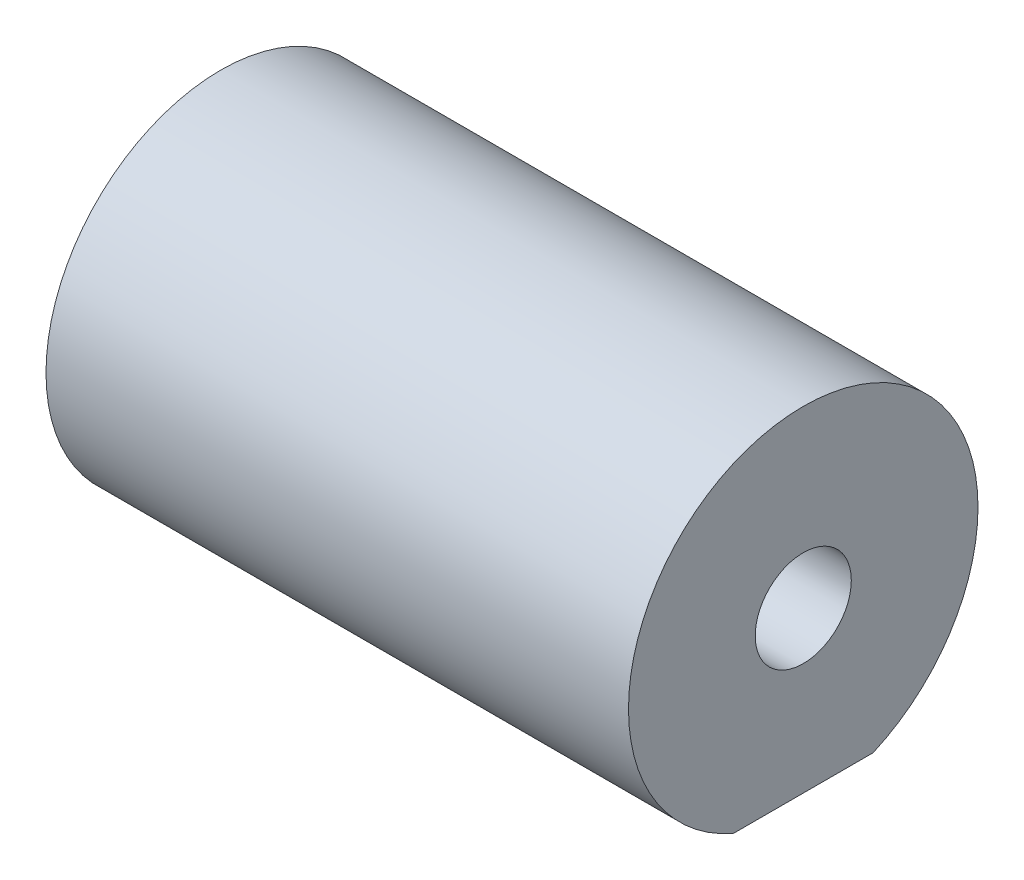
ISO-10303-21;
HEADER;
FILE_DESCRIPTION(('STEP AP214'),'2;1');
FILE_NAME('part.step','',(''),(''),'','','');
FILE_SCHEMA(('AUTOMOTIVE_DESIGN { 1 0 10303 214 1 1 1 1 }'));
ENDSEC;
DATA;
#1=APPLICATION_CONTEXT('core data for automotive mechanical design processes');
#2=APPLICATION_PROTOCOL_DEFINITION('international standard','automotive_design',2000,#1);
#3=PRODUCT_CONTEXT('',#1,'mechanical');
#4=PRODUCT('Part','Part','',(#3));
#5=PRODUCT_RELATED_PRODUCT_CATEGORY('part','',(#4));
#6=PRODUCT_DEFINITION_FORMATION('','',#4);
#7=PRODUCT_DEFINITION_CONTEXT('part definition',#1,'design');
#8=PRODUCT_DEFINITION('design','',#6,#7);
#9=PRODUCT_DEFINITION_SHAPE('','',#8);
#10=(LENGTH_UNIT() NAMED_UNIT(*) SI_UNIT(.MILLI.,.METRE.));
#11=(NAMED_UNIT(*) PLANE_ANGLE_UNIT() SI_UNIT($,.RADIAN.));
#12=(NAMED_UNIT(*) SI_UNIT($,.STERADIAN.) SOLID_ANGLE_UNIT());
#13=UNCERTAINTY_MEASURE_WITH_UNIT(LENGTH_MEASURE(1.E-05),#10,'distance_accuracy_value','');
#14=(GEOMETRIC_REPRESENTATION_CONTEXT(3) GLOBAL_UNCERTAINTY_ASSIGNED_CONTEXT((#13)) GLOBAL_UNIT_ASSIGNED_CONTEXT((#10,
#11,#12)) REPRESENTATION_CONTEXT('',''));
#15=CARTESIAN_POINT('',(0.,0.,0.));
#16=DIRECTION('',(0.,0.,1.));
#17=DIRECTION('',(1.,0.,0.));
#18=AXIS2_PLACEMENT_3D('',#15,#16,#17);
#19=CARTESIAN_POINT('',(20.,0.,0.));
#20=DIRECTION('',(-1.,0.,0.));
#21=DIRECTION('',(0.,0.,1.));
#22=AXIS2_PLACEMENT_3D('',#19,#20,#21);
#23=CYLINDRICAL_SURFACE('',#22,6.);
#24=CARTESIAN_POINT('',(20.,0.,0.));
#25=DIRECTION('',(1.,0.,0.));
#26=DIRECTION('',(0.,0.,-1.));
#27=AXIS2_PLACEMENT_3D('',#24,#25,#26);
#28=CIRCLE('',#27,6.);
#29=CARTESIAN_POINT('',(20.,-5.5,-2.39791576165636));
#30=VERTEX_POINT('',#29);
#31=CARTESIAN_POINT('',(20.,-5.5,2.39791576165636));
#32=VERTEX_POINT('',#31);
#33=EDGE_CURVE('E11',#30,#32,#28,.T.);
#34=ORIENTED_EDGE('',*,*,#33,.F.);
#35=DIRECTION('',(1.,0.,0.));
#36=VECTOR('',#35,1.);
#37=CARTESIAN_POINT('',(0.,-5.5,-2.39791576165636));
#38=LINE('',#37,#36);
#39=CARTESIAN_POINT('',(0.,-5.5,-2.39791576165636));
#40=VERTEX_POINT('',#39);
#41=EDGE_CURVE('E59',#40,#30,#38,.T.);
#42=ORIENTED_EDGE('',*,*,#41,.F.);
#43=CARTESIAN_POINT('',(0.,0.,0.));
#44=DIRECTION('',(1.,0.,0.));
#45=DIRECTION('',(0.,0.,-1.));
#46=AXIS2_PLACEMENT_3D('',#43,#44,#45);
#47=CIRCLE('',#46,6.);
#48=CARTESIAN_POINT('',(0.,-5.5,2.39791576165636));
#49=VERTEX_POINT('',#48);
#50=EDGE_CURVE('E36',#40,#49,#47,.T.);
#51=ORIENTED_EDGE('',*,*,#50,.T.);
#52=DIRECTION('',(1.,0.,0.));
#53=VECTOR('',#52,1.);
#54=CARTESIAN_POINT('',(0.,-5.5,2.39791576165636));
#55=LINE('',#54,#53);
#56=EDGE_CURVE('E47',#49,#32,#55,.T.);
#57=ORIENTED_EDGE('',*,*,#56,.T.);
#58=EDGE_LOOP('',(#34,#42,#51,#57));
#59=FACE_BOUND('',#58,.T.);
#60=ADVANCED_FACE('F33',(#59),#23,.T.);
#61=CARTESIAN_POINT('',(20.,0.,0.));
#62=DIRECTION('',(1.,0.,0.));
#63=DIRECTION('',(0.,0.,-1.));
#64=AXIS2_PLACEMENT_3D('',#61,#62,#63);
#65=PLANE('',#64);
#66=DIRECTION('',(0.,0.,1.));
#67=VECTOR('',#66,1.);
#68=CARTESIAN_POINT('',(20.,-5.5,0.));
#69=LINE('',#68,#67);
#70=EDGE_CURVE('E57',#30,#32,#69,.T.);
#71=ORIENTED_EDGE('',*,*,#70,.F.);
#72=ORIENTED_EDGE('',*,*,#33,.T.);
#73=EDGE_LOOP('',(#71,#72));
#74=FACE_BOUND('',#73,.T.);
#75=CARTESIAN_POINT('',(20.,0.,0.));
#76=DIRECTION('',(1.,0.,0.));
#77=DIRECTION('',(0.,0.,-1.));
#78=AXIS2_PLACEMENT_3D('',#75,#76,#77);
#79=CIRCLE('',#78,1.65);
#80=CARTESIAN_POINT('',(20.,0.,-1.65));
#81=VERTEX_POINT('',#80);
#82=EDGE_CURVE('E74',#81,#81,#79,.T.);
#83=ORIENTED_EDGE('',*,*,#82,.F.);
#84=EDGE_LOOP('',(#83));
#85=FACE_BOUND('',#84,.T.);
#86=ADVANCED_FACE('F67',(#74,#85),#65,.T.);
#87=CARTESIAN_POINT('',(0.,0.,0.));
#88=DIRECTION('',(1.,0.,0.));
#89=DIRECTION('',(0.,0.,-1.));
#90=AXIS2_PLACEMENT_3D('',#87,#88,#89);
#91=PLANE('',#90);
#92=CARTESIAN_POINT('',(0.,0.,0.));
#93=DIRECTION('',(1.,0.,0.));
#94=DIRECTION('',(0.,0.,-1.));
#95=AXIS2_PLACEMENT_3D('',#92,#93,#94);
#96=CIRCLE('',#95,1.65);
#97=CARTESIAN_POINT('',(0.,0.,-1.65));
#98=VERTEX_POINT('',#97);
#99=EDGE_CURVE('E76',#98,#98,#96,.T.);
#100=ORIENTED_EDGE('',*,*,#99,.T.);
#101=EDGE_LOOP('',(#100));
#102=FACE_BOUND('',#101,.T.);
#103=ORIENTED_EDGE('',*,*,#50,.F.);
#104=DIRECTION('',(0.,0.,1.));
#105=VECTOR('',#104,1.);
#106=CARTESIAN_POINT('',(0.,-5.5,0.));
#107=LINE('',#106,#105);
#108=EDGE_CURVE('E52',#40,#49,#107,.T.);
#109=ORIENTED_EDGE('',*,*,#108,.T.);
#110=EDGE_LOOP('',(#103,#109));
#111=FACE_BOUND('',#110,.T.);
#112=ADVANCED_FACE('F70',(#102,#111),#91,.F.);
#113=CARTESIAN_POINT('',(0.,0.,0.));
#114=DIRECTION('',(1.,0.,0.));
#115=DIRECTION('',(0.,0.,-1.));
#116=AXIS2_PLACEMENT_3D('',#113,#114,#115);
#117=CYLINDRICAL_SURFACE('',#116,1.65);
#118=ORIENTED_EDGE('',*,*,#99,.F.);
#119=EDGE_LOOP('',(#118));
#120=FACE_BOUND('',#119,.T.);
#121=ORIENTED_EDGE('',*,*,#82,.T.);
#122=EDGE_LOOP('',(#121));
#123=FACE_BOUND('',#122,.T.);
#124=ADVANCED_FACE('F84',(#120,#123),#117,.F.);
#125=CARTESIAN_POINT('',(0.,-5.5,0.));
#126=DIRECTION('',(0.,1.,0.));
#127=DIRECTION('',(0.,0.,1.));
#128=AXIS2_PLACEMENT_3D('',#125,#126,#127);
#129=PLANE('',#128);
#130=ORIENTED_EDGE('',*,*,#70,.T.);
#131=ORIENTED_EDGE('',*,*,#56,.F.);
#132=ORIENTED_EDGE('',*,*,#108,.F.);
#133=ORIENTED_EDGE('',*,*,#41,.T.);
#134=EDGE_LOOP('',(#130,#131,#132,#133));
#135=FACE_BOUND('',#134,.T.);
#136=ADVANCED_FACE('F58',(#135),#129,.F.);
#137=CLOSED_SHELL('',(#60,#86,#112,#124,#136));
#138=MANIFOLD_SOLID_BREP('B2',#137);
#139=ADVANCED_BREP_SHAPE_REPRESENTATION('',(#18,#138),#14);
#140=SHAPE_DEFINITION_REPRESENTATION(#9,#139);
ENDSEC;
END-ISO-10303-21;
